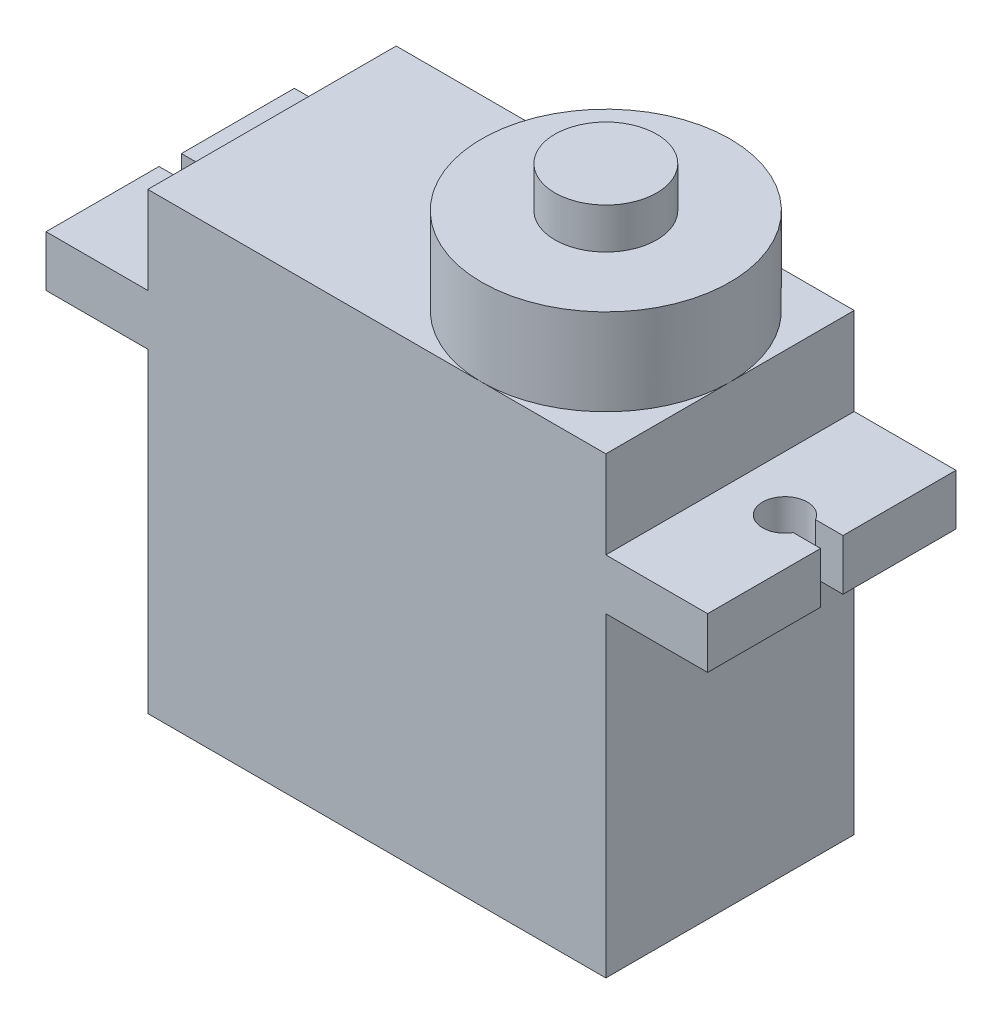
ISO-10303-21;
HEADER;
FILE_DESCRIPTION(('STEP AP214'),'2;1');
FILE_NAME('part.step','',(''),(''),'','','');
FILE_SCHEMA(('AUTOMOTIVE_DESIGN { 1 0 10303 214 1 1 1 1 }'));
ENDSEC;
DATA;
#1=APPLICATION_CONTEXT('core data for automotive mechanical design processes');
#2=APPLICATION_PROTOCOL_DEFINITION('international standard','automotive_design',2000,#1);
#3=PRODUCT_CONTEXT('',#1,'mechanical');
#4=PRODUCT('Part','Part','',(#3));
#5=PRODUCT_RELATED_PRODUCT_CATEGORY('part','',(#4));
#6=PRODUCT_DEFINITION_FORMATION('','',#4);
#7=PRODUCT_DEFINITION_CONTEXT('part definition',#1,'design');
#8=PRODUCT_DEFINITION('design','',#6,#7);
#9=PRODUCT_DEFINITION_SHAPE('','',#8);
#10=(LENGTH_UNIT() NAMED_UNIT(*) SI_UNIT(.MILLI.,.METRE.));
#11=(NAMED_UNIT(*) PLANE_ANGLE_UNIT() SI_UNIT($,.RADIAN.));
#12=(NAMED_UNIT(*) SI_UNIT($,.STERADIAN.) SOLID_ANGLE_UNIT());
#13=UNCERTAINTY_MEASURE_WITH_UNIT(LENGTH_MEASURE(1.E-05),#10,'distance_accuracy_value','');
#14=(GEOMETRIC_REPRESENTATION_CONTEXT(3) GLOBAL_UNCERTAINTY_ASSIGNED_CONTEXT((#13)) GLOBAL_UNIT_ASSIGNED_CONTEXT((#10,
#11,#12)) REPRESENTATION_CONTEXT('',''));
#15=CARTESIAN_POINT('',(0.,0.,0.));
#16=DIRECTION('',(0.,0.,1.));
#17=DIRECTION('',(1.,0.,0.));
#18=AXIS2_PLACEMENT_3D('',#15,#16,#17);
#19=CARTESIAN_POINT('',(0.,22.3,0.));
#20=DIRECTION('',(0.,1.,0.));
#21=DIRECTION('',(0.,0.,1.));
#22=AXIS2_PLACEMENT_3D('',#19,#20,#21);
#23=PLANE('',#22);
#24=CARTESIAN_POINT('',(8.51903614457832,22.3,0.994939759036145));
#25=DIRECTION('',(0.,1.,0.));
#26=DIRECTION('',(0.,0.,1.));
#27=AXIS2_PLACEMENT_3D('',#24,#25,#26);
#28=CIRCLE('',#27,6.1);
#29=CARTESIAN_POINT('',(8.51903614457832,22.3,7.09493975903614));
#30=VERTEX_POINT('',#29);
#31=CARTESIAN_POINT('',(14.6190361445783,22.3,0.994939759036145));
#32=VERTEX_POINT('',#31);
#33=EDGE_CURVE('E211',#30,#32,#28,.T.);
#34=ORIENTED_EDGE('',*,*,#33,.F.);
#35=DIRECTION('',(1.,0.,0.));
#36=VECTOR('',#35,1.);
#37=CARTESIAN_POINT('',(-7.88096385542167,22.3,7.09493975903614));
#38=LINE('',#37,#36);
#39=CARTESIAN_POINT('',(14.6190361445783,22.3,7.09493975903614));
#40=VERTEX_POINT('',#39);
#41=EDGE_CURVE('E198',#30,#40,#38,.T.);
#42=ORIENTED_EDGE('',*,*,#41,.T.);
#43=DIRECTION('',(0.,0.,-1.));
#44=VECTOR('',#43,1.);
#45=CARTESIAN_POINT('',(14.6190361445783,22.3,-5.10506024096386));
#46=LINE('',#45,#44);
#47=EDGE_CURVE('E212',#40,#32,#46,.T.);
#48=ORIENTED_EDGE('',*,*,#47,.T.);
#49=EDGE_LOOP('',(#34,#42,#48));
#50=FACE_BOUND('',#49,.T.);
#51=ADVANCED_FACE('F41',(#50),#23,.T.);
#52=CARTESIAN_POINT('',(8.51903614457832,22.3,-5.10506024096385));
#53=VERTEX_POINT('',#52);
#54=EDGE_CURVE('E51',#32,#53,#28,.T.);
#55=ORIENTED_EDGE('',*,*,#54,.F.);
#56=CARTESIAN_POINT('',(14.6190361445783,22.3,-5.10506024096386));
#57=VERTEX_POINT('',#56);
#58=EDGE_CURVE('E197',#32,#57,#46,.T.);
#59=ORIENTED_EDGE('',*,*,#58,.T.);
#60=DIRECTION('',(-1.,0.,0.));
#61=VECTOR('',#60,1.);
#62=CARTESIAN_POINT('',(-7.88096385542168,22.3,-5.10506024096386));
#63=LINE('',#62,#61);
#64=EDGE_CURVE('E363',#57,#53,#63,.T.);
#65=ORIENTED_EDGE('',*,*,#64,.T.);
#66=EDGE_LOOP('',(#55,#59,#65));
#67=FACE_BOUND('',#66,.T.);
#68=ADVANCED_FACE('F454',(#67),#23,.T.);
#69=CARTESIAN_POINT('',(-12.8809638554217,0.,0.));
#70=DIRECTION('',(-1.,0.,0.));
#71=DIRECTION('',(0.,0.,-1.));
#72=AXIS2_PLACEMENT_3D('',#69,#70,#71);
#73=PLANE('',#72);
#74=DIRECTION('',(0.,0.,1.));
#75=VECTOR('',#74,1.);
#76=CARTESIAN_POINT('',(-12.8809638554217,18.,7.09493975903614));
#77=LINE('',#76,#75);
#78=CARTESIAN_POINT('',(-12.8809638554217,18.,1.54493975903614));
#79=VERTEX_POINT('',#78);
#80=CARTESIAN_POINT('',(-12.8809638554217,18.,7.09493975903614));
#81=VERTEX_POINT('',#80);
#82=EDGE_CURVE('E255',#79,#81,#77,.T.);
#83=ORIENTED_EDGE('',*,*,#82,.F.);
#84=DIRECTION('',(0.,-1.,0.));
#85=VECTOR('',#84,1.);
#86=CARTESIAN_POINT('',(-12.8809638554217,0.,1.54493975903614));
#87=LINE('',#86,#85);
#88=CARTESIAN_POINT('',(-12.8809638554217,15.5,1.54493975903614));
#89=VERTEX_POINT('',#88);
#90=EDGE_CURVE('E403',#79,#89,#87,.T.);
#91=ORIENTED_EDGE('',*,*,#90,.T.);
#92=DIRECTION('',(0.,0.,-1.));
#93=VECTOR('',#92,1.);
#94=CARTESIAN_POINT('',(-12.8809638554217,15.5,7.09493975903614));
#95=LINE('',#94,#93);
#96=CARTESIAN_POINT('',(-12.8809638554217,15.5,7.09493975903614));
#97=VERTEX_POINT('',#96);
#98=EDGE_CURVE('E266',#97,#89,#95,.T.);
#99=ORIENTED_EDGE('',*,*,#98,.F.);
#100=DIRECTION('',(0.,-1.,0.));
#101=VECTOR('',#100,1.);
#102=CARTESIAN_POINT('',(-12.8809638554217,18.,7.09493975903614));
#103=LINE('',#102,#101);
#104=EDGE_CURVE('E251',#81,#97,#103,.T.);
#105=ORIENTED_EDGE('',*,*,#104,.F.);
#106=EDGE_LOOP('',(#83,#91,#99,#105));
#107=FACE_BOUND('',#106,.T.);
#108=ADVANCED_FACE('F459',(#107),#73,.T.);
#109=CARTESIAN_POINT('',(-7.88096385542168,22.3,-5.10506024096386));
#110=DIRECTION('',(1.,0.,0.));
#111=DIRECTION('',(0.,0.,-1.));
#112=AXIS2_PLACEMENT_3D('',#109,#110,#111);
#113=PLANE('',#112);
#114=DIRECTION('',(0.,-1.,0.));
#115=VECTOR('',#114,1.);
#116=CARTESIAN_POINT('',(-7.88096385542167,22.3,7.09493975903614));
#117=LINE('',#116,#115);
#118=CARTESIAN_POINT('',(-7.88096385542167,15.5,7.09493975903614));
#119=VERTEX_POINT('',#118);
#120=CARTESIAN_POINT('',(-7.88096385542167,0.,7.09493975903614));
#121=VERTEX_POINT('',#120);
#122=EDGE_CURVE('E392',#119,#121,#117,.T.);
#123=ORIENTED_EDGE('',*,*,#122,.F.);
#124=DIRECTION('',(0.,0.,-1.));
#125=VECTOR('',#124,1.);
#126=CARTESIAN_POINT('',(-7.88096385542167,15.5,7.09493975903614));
#127=LINE('',#126,#125);
#128=CARTESIAN_POINT('',(-7.88096385542167,15.5,-5.10506024096385));
#129=VERTEX_POINT('',#128);
#130=EDGE_CURVE('E256',#119,#129,#127,.T.);
#131=ORIENTED_EDGE('',*,*,#130,.T.);
#132=DIRECTION('',(0.,-1.,0.));
#133=VECTOR('',#132,1.);
#134=CARTESIAN_POINT('',(-7.88096385542168,22.3,-5.10506024096386));
#135=LINE('',#134,#133);
#136=CARTESIAN_POINT('',(-7.88096385542168,0.,-5.10506024096386));
#137=VERTEX_POINT('',#136);
#138=EDGE_CURVE('E366',#129,#137,#135,.T.);
#139=ORIENTED_EDGE('',*,*,#138,.T.);
#140=DIRECTION('',(0.,0.,1.));
#141=VECTOR('',#140,1.);
#142=CARTESIAN_POINT('',(-7.88096385542168,0.,-5.10506024096386));
#143=LINE('',#142,#141);
#144=EDGE_CURVE('E356',#137,#121,#143,.T.);
#145=ORIENTED_EDGE('',*,*,#144,.T.);
#146=EDGE_LOOP('',(#123,#131,#139,#145));
#147=FACE_BOUND('',#146,.T.);
#148=ADVANCED_FACE('F542',(#147),#113,.F.);
#149=CARTESIAN_POINT('',(19.6190361445783,15.5,7.09493975903614));
#150=DIRECTION('',(0.,1.,0.));
#151=DIRECTION('',(0.,0.,1.));
#152=AXIS2_PLACEMENT_3D('',#149,#150,#151);
#153=PLANE('',#152);
#154=DIRECTION('',(1.,0.,0.));
#155=VECTOR('',#154,1.);
#156=CARTESIAN_POINT('',(19.6190361445783,15.5,0.444939759036144));
#157=LINE('',#156,#155);
#158=CARTESIAN_POINT('',(18.2716640887412,15.5,0.444939759036143));
#159=VERTEX_POINT('',#158);
#160=CARTESIAN_POINT('',(19.6190361445783,15.5,0.444939759036144));
#161=VERTEX_POINT('',#160);
#162=EDGE_CURVE('E309',#159,#161,#157,.T.);
#163=ORIENTED_EDGE('',*,*,#162,.F.);
#164=CARTESIAN_POINT('',(17.3190361445783,15.5,0.994939759036145));
#165=DIRECTION('',(0.,1.,0.));
#166=DIRECTION('',(0.,0.,1.));
#167=AXIS2_PLACEMENT_3D('',#164,#165,#166);
#168=CIRCLE('',#167,1.1);
#169=CARTESIAN_POINT('',(18.2716640887412,15.5,1.54493975903614));
#170=VERTEX_POINT('',#169);
#171=EDGE_CURVE('E312',#159,#170,#168,.T.);
#172=ORIENTED_EDGE('',*,*,#171,.T.);
#173=DIRECTION('',(1.,0.,0.));
#174=VECTOR('',#173,1.);
#175=CARTESIAN_POINT('',(19.6190361445783,15.5,1.54493975903614));
#176=LINE('',#175,#174);
#177=CARTESIAN_POINT('',(19.6190361445783,15.5,1.54493975903614));
#178=VERTEX_POINT('',#177);
#179=EDGE_CURVE('E305',#170,#178,#176,.T.);
#180=ORIENTED_EDGE('',*,*,#179,.T.);
#181=DIRECTION('',(0.,0.,-1.));
#182=VECTOR('',#181,1.);
#183=CARTESIAN_POINT('',(19.6190361445783,15.5,7.09493975903614));
#184=LINE('',#183,#182);
#185=CARTESIAN_POINT('',(19.6190361445783,15.5,7.09493975903614));
#186=VERTEX_POINT('',#185);
#187=EDGE_CURVE('E323',#186,#178,#184,.T.);
#188=ORIENTED_EDGE('',*,*,#187,.F.);
#189=DIRECTION('',(-1.,0.,0.));
#190=VECTOR('',#189,1.);
#191=CARTESIAN_POINT('',(19.6190361445783,15.5,7.09493975903614));
#192=LINE('',#191,#190);
#193=CARTESIAN_POINT('',(14.6190361445783,15.5,7.09493975903614));
#194=VERTEX_POINT('',#193);
#195=EDGE_CURVE('E352',#186,#194,#192,.T.);
#196=ORIENTED_EDGE('',*,*,#195,.T.);
#197=DIRECTION('',(0.,0.,-1.));
#198=VECTOR('',#197,1.);
#199=CARTESIAN_POINT('',(14.6190361445783,15.5,7.09493975903614));
#200=LINE('',#199,#198);
#201=CARTESIAN_POINT('',(14.6190361445783,15.5,-5.10506024096385));
#202=VERTEX_POINT('',#201);
#203=EDGE_CURVE('E316',#194,#202,#200,.T.);
#204=ORIENTED_EDGE('',*,*,#203,.T.);
#205=DIRECTION('',(-1.,0.,0.));
#206=VECTOR('',#205,1.);
#207=CARTESIAN_POINT('',(19.6190361445783,15.5,-5.10506024096385));
#208=LINE('',#207,#206);
#209=CARTESIAN_POINT('',(19.6190361445783,15.5,-5.10506024096385));
#210=VERTEX_POINT('',#209);
#211=EDGE_CURVE('E348',#210,#202,#208,.T.);
#212=ORIENTED_EDGE('',*,*,#211,.F.);
#213=EDGE_CURVE('E321',#161,#210,#184,.T.);
#214=ORIENTED_EDGE('',*,*,#213,.F.);
#215=EDGE_LOOP('',(#163,#172,#180,#188,#196,#204,#212,#214));
#216=FACE_BOUND('',#215,.T.);
#217=ADVANCED_FACE('F503',(#216),#153,.F.);
#218=CARTESIAN_POINT('',(19.6190361445783,18.,7.09493975903614));
#219=DIRECTION('',(0.,-1.,0.));
#220=DIRECTION('',(0.,0.,-1.));
#221=AXIS2_PLACEMENT_3D('',#218,#219,#220);
#222=PLANE('',#221);
#223=DIRECTION('',(1.,0.,0.));
#224=VECTOR('',#223,1.);
#225=CARTESIAN_POINT('',(18.2716640887412,18.,0.444939759036144));
#226=LINE('',#225,#224);
#227=CARTESIAN_POINT('',(18.2716640887412,18.,0.444939759036143));
#228=VERTEX_POINT('',#227);
#229=CARTESIAN_POINT('',(19.6190361445783,18.,0.444939759036144));
#230=VERTEX_POINT('',#229);
#231=EDGE_CURVE('E288',#228,#230,#226,.T.);
#232=ORIENTED_EDGE('',*,*,#231,.T.);
#233=DIRECTION('',(0.,0.,1.));
#234=VECTOR('',#233,1.);
#235=CARTESIAN_POINT('',(19.6190361445783,18.,7.09493975903614));
#236=LINE('',#235,#234);
#237=CARTESIAN_POINT('',(19.6190361445783,18.,-5.10506024096386));
#238=VERTEX_POINT('',#237);
#239=EDGE_CURVE('E331',#238,#230,#236,.T.);
#240=ORIENTED_EDGE('',*,*,#239,.F.);
#241=DIRECTION('',(-1.,0.,0.));
#242=VECTOR('',#241,1.);
#243=CARTESIAN_POINT('',(19.6190361445783,18.,-5.10506024096386));
#244=LINE('',#243,#242);
#245=CARTESIAN_POINT('',(14.6190361445783,18.,-5.10506024096386));
#246=VERTEX_POINT('',#245);
#247=EDGE_CURVE('E344',#238,#246,#244,.T.);
#248=ORIENTED_EDGE('',*,*,#247,.T.);
#249=DIRECTION('',(0.,0.,1.));
#250=VECTOR('',#249,1.);
#251=CARTESIAN_POINT('',(14.6190361445783,18.,7.09493975903614));
#252=LINE('',#251,#250);
#253=CARTESIAN_POINT('',(14.6190361445783,18.,7.09493975903614));
#254=VERTEX_POINT('',#253);
#255=EDGE_CURVE('E322',#246,#254,#252,.T.);
#256=ORIENTED_EDGE('',*,*,#255,.T.);
#257=DIRECTION('',(-1.,0.,0.));
#258=VECTOR('',#257,1.);
#259=CARTESIAN_POINT('',(19.6190361445783,18.,7.09493975903614));
#260=LINE('',#259,#258);
#261=CARTESIAN_POINT('',(19.6190361445783,18.,7.09493975903614));
#262=VERTEX_POINT('',#261);
#263=EDGE_CURVE('E335',#262,#254,#260,.T.);
#264=ORIENTED_EDGE('',*,*,#263,.F.);
#265=CARTESIAN_POINT('',(19.6190361445783,18.,1.54493975903614));
#266=VERTEX_POINT('',#265);
#267=EDGE_CURVE('E330',#266,#262,#236,.T.);
#268=ORIENTED_EDGE('',*,*,#267,.F.);
#269=DIRECTION('',(1.,0.,0.));
#270=VECTOR('',#269,1.);
#271=CARTESIAN_POINT('',(18.2716640887412,18.,1.54493975903614));
#272=LINE('',#271,#270);
#273=CARTESIAN_POINT('',(18.2716640887412,18.,1.54493975903614));
#274=VERTEX_POINT('',#273);
#275=EDGE_CURVE('E292',#274,#266,#272,.T.);
#276=ORIENTED_EDGE('',*,*,#275,.F.);
#277=CARTESIAN_POINT('',(17.3190361445783,18.,0.994939759036145));
#278=DIRECTION('',(0.,1.,0.));
#279=DIRECTION('',(0.,0.,1.));
#280=AXIS2_PLACEMENT_3D('',#277,#278,#279);
#281=CIRCLE('',#280,1.1);
#282=EDGE_CURVE('E295',#228,#274,#281,.T.);
#283=ORIENTED_EDGE('',*,*,#282,.F.);
#284=EDGE_LOOP('',(#232,#240,#248,#256,#264,#268,#276,#283));
#285=FACE_BOUND('',#284,.T.);
#286=ADVANCED_FACE('F487',(#285),#222,.F.);
#287=CARTESIAN_POINT('',(19.6190361445783,0.,0.));
#288=DIRECTION('',(1.,0.,0.));
#289=DIRECTION('',(0.,0.,-1.));
#290=AXIS2_PLACEMENT_3D('',#287,#288,#289);
#291=PLANE('',#290);
#292=ORIENTED_EDGE('',*,*,#239,.T.);
#293=DIRECTION('',(0.,-1.,0.));
#294=VECTOR('',#293,1.);
#295=CARTESIAN_POINT('',(19.6190361445783,0.,0.444939759036144));
#296=LINE('',#295,#294);
#297=EDGE_CURVE('E399',#230,#161,#296,.T.);
#298=ORIENTED_EDGE('',*,*,#297,.T.);
#299=ORIENTED_EDGE('',*,*,#213,.T.);
#300=DIRECTION('',(0.,1.,0.));
#301=VECTOR('',#300,1.);
#302=CARTESIAN_POINT('',(19.6190361445783,18.,-5.10506024096386));
#303=LINE('',#302,#301);
#304=EDGE_CURVE('E327',#210,#238,#303,.T.);
#305=ORIENTED_EDGE('',*,*,#304,.T.);
#306=EDGE_LOOP('',(#292,#298,#299,#305));
#307=FACE_BOUND('',#306,.T.);
#308=ADVANCED_FACE('F480',(#307),#291,.T.);
#309=CARTESIAN_POINT('',(14.6190361445783,22.3,-5.10506024096386));
#310=DIRECTION('',(-1.,0.,0.));
#311=DIRECTION('',(0.,0.,1.));
#312=AXIS2_PLACEMENT_3D('',#309,#310,#311);
#313=PLANE('',#312);
#314=ORIENTED_EDGE('',*,*,#255,.F.);
#315=DIRECTION('',(0.,-1.,0.));
#316=VECTOR('',#315,1.);
#317=CARTESIAN_POINT('',(14.6190361445783,22.3,-5.10506024096386));
#318=LINE('',#317,#316);
#319=EDGE_CURVE('E385',#57,#246,#318,.T.);
#320=ORIENTED_EDGE('',*,*,#319,.F.);
#321=ORIENTED_EDGE('',*,*,#58,.F.);
#322=ORIENTED_EDGE('',*,*,#47,.F.);
#323=DIRECTION('',(0.,-1.,0.));
#324=VECTOR('',#323,1.);
#325=CARTESIAN_POINT('',(14.6190361445783,22.3,7.09493975903614));
#326=LINE('',#325,#324);
#327=EDGE_CURVE('E205',#40,#254,#326,.T.);
#328=ORIENTED_EDGE('',*,*,#327,.T.);
#329=EDGE_LOOP('',(#314,#320,#321,#322,#328));
#330=FACE_BOUND('',#329,.T.);
#331=ADVANCED_FACE('F477',(#330),#313,.F.);
#332=ORIENTED_EDGE('',*,*,#203,.F.);
#333=CARTESIAN_POINT('',(14.6190361445783,0.,7.09493975903614));
#334=VERTEX_POINT('',#333);
#335=EDGE_CURVE('E389',#194,#334,#326,.T.);
#336=ORIENTED_EDGE('',*,*,#335,.T.);
#337=DIRECTION('',(0.,0.,-1.));
#338=VECTOR('',#337,1.);
#339=CARTESIAN_POINT('',(14.6190361445783,0.,-5.10506024096386));
#340=LINE('',#339,#338);
#341=CARTESIAN_POINT('',(14.6190361445783,0.,-5.10506024096386));
#342=VERTEX_POINT('',#341);
#343=EDGE_CURVE('E373',#334,#342,#340,.T.);
#344=ORIENTED_EDGE('',*,*,#343,.T.);
#345=EDGE_CURVE('E384',#202,#342,#318,.T.);
#346=ORIENTED_EDGE('',*,*,#345,.F.);
#347=EDGE_LOOP('',(#332,#336,#344,#346));
#348=FACE_BOUND('',#347,.T.);
#349=ADVANCED_FACE('F479',(#348),#313,.F.);
#350=CARTESIAN_POINT('',(-7.88096385542168,22.3,-5.10506024096386));
#351=VERTEX_POINT('',#350);
#352=CARTESIAN_POINT('',(-7.88096385542167,18.,-5.10506024096386));
#353=VERTEX_POINT('',#352);
#354=EDGE_CURVE('E380',#351,#353,#135,.T.);
#355=ORIENTED_EDGE('',*,*,#354,.T.);
#356=DIRECTION('',(0.,0.,1.));
#357=VECTOR('',#356,1.);
#358=CARTESIAN_POINT('',(-7.88096385542167,18.,7.09493975903614));
#359=LINE('',#358,#357);
#360=CARTESIAN_POINT('',(-7.88096385542167,18.,7.09493975903614));
#361=VERTEX_POINT('',#360);
#362=EDGE_CURVE('E250',#353,#361,#359,.T.);
#363=ORIENTED_EDGE('',*,*,#362,.T.);
#364=CARTESIAN_POINT('',(-7.88096385542167,22.3,7.09493975903614));
#365=VERTEX_POINT('',#364);
#366=EDGE_CURVE('E393',#365,#361,#117,.T.);
#367=ORIENTED_EDGE('',*,*,#366,.F.);
#368=DIRECTION('',(0.,0.,1.));
#369=VECTOR('',#368,1.);
#370=CARTESIAN_POINT('',(-7.88096385542168,22.3,-5.10506024096386));
#371=LINE('',#370,#369);
#372=EDGE_CURVE('E192',#351,#365,#371,.T.);
#373=ORIENTED_EDGE('',*,*,#372,.F.);
#374=EDGE_LOOP('',(#355,#363,#367,#373));
#375=FACE_BOUND('',#374,.T.);
#376=ADVANCED_FACE('F43',(#375),#113,.F.);
#377=CARTESIAN_POINT('',(-7.88096385542167,22.3,7.09493975903614));
#378=DIRECTION('',(0.,0.,-1.));
#379=DIRECTION('',(-1.,0.,0.));
#380=AXIS2_PLACEMENT_3D('',#377,#378,#379);
#381=PLANE('',#380);
#382=DIRECTION('',(1.,0.,0.));
#383=VECTOR('',#382,1.);
#384=CARTESIAN_POINT('',(-7.88096385542167,0.,7.09493975903614));
#385=LINE('',#384,#383);
#386=EDGE_CURVE('E370',#121,#334,#385,.T.);
#387=ORIENTED_EDGE('',*,*,#386,.T.);
#388=ORIENTED_EDGE('',*,*,#335,.F.);
#389=ORIENTED_EDGE('',*,*,#195,.F.);
#390=DIRECTION('',(0.,-1.,0.));
#391=VECTOR('',#390,1.);
#392=CARTESIAN_POINT('',(19.6190361445783,18.,7.09493975903614));
#393=LINE('',#392,#391);
#394=EDGE_CURVE('E317',#262,#186,#393,.T.);
#395=ORIENTED_EDGE('',*,*,#394,.F.);
#396=ORIENTED_EDGE('',*,*,#263,.T.);
#397=ORIENTED_EDGE('',*,*,#327,.F.);
#398=ORIENTED_EDGE('',*,*,#41,.F.);
#399=EDGE_CURVE('E188',#365,#30,#38,.T.);
#400=ORIENTED_EDGE('',*,*,#399,.F.);
#401=ORIENTED_EDGE('',*,*,#366,.T.);
#402=DIRECTION('',(1.,0.,0.));
#403=VECTOR('',#402,1.);
#404=CARTESIAN_POINT('',(-12.8809638554217,18.,7.09493975903614));
#405=LINE('',#404,#403);
#406=EDGE_CURVE('E285',#81,#361,#405,.T.);
#407=ORIENTED_EDGE('',*,*,#406,.F.);
#408=ORIENTED_EDGE('',*,*,#104,.T.);
#409=DIRECTION('',(1.,0.,0.));
#410=VECTOR('',#409,1.);
#411=CARTESIAN_POINT('',(-12.8809638554217,15.5,7.09493975903614));
#412=LINE('',#411,#410);
#413=EDGE_CURVE('E270',#97,#119,#412,.T.);
#414=ORIENTED_EDGE('',*,*,#413,.T.);
#415=ORIENTED_EDGE('',*,*,#122,.T.);
#416=EDGE_LOOP('',(#387,#388,#389,#395,#396,#397,#398,#400,#401,#407,#408,#414,#415));
#417=FACE_BOUND('',#416,.T.);
#418=ADVANCED_FACE('F203',(#417),#381,.F.);
#419=CARTESIAN_POINT('',(-7.88096385542168,22.3,-5.10506024096386));
#420=DIRECTION('',(0.,0.,1.));
#421=DIRECTION('',(1.,0.,0.));
#422=AXIS2_PLACEMENT_3D('',#419,#420,#421);
#423=PLANE('',#422);
#424=DIRECTION('',(-1.,0.,0.));
#425=VECTOR('',#424,1.);
#426=CARTESIAN_POINT('',(-7.88096385542168,0.,-5.10506024096386));
#427=LINE('',#426,#425);
#428=EDGE_CURVE('E358',#342,#137,#427,.T.);
#429=ORIENTED_EDGE('',*,*,#428,.T.);
#430=ORIENTED_EDGE('',*,*,#138,.F.);
#431=DIRECTION('',(1.,0.,0.));
#432=VECTOR('',#431,1.);
#433=CARTESIAN_POINT('',(-12.8809638554217,15.5,-5.10506024096385));
#434=LINE('',#433,#432);
#435=CARTESIAN_POINT('',(-12.8809638554217,15.5,-5.10506024096385));
#436=VERTEX_POINT('',#435);
#437=EDGE_CURVE('E279',#436,#129,#434,.T.);
#438=ORIENTED_EDGE('',*,*,#437,.F.);
#439=DIRECTION('',(0.,1.,0.));
#440=VECTOR('',#439,1.);
#441=CARTESIAN_POINT('',(-12.8809638554217,18.,-5.10506024096386));
#442=LINE('',#441,#440);
#443=CARTESIAN_POINT('',(-12.8809638554217,18.,-5.10506024096386));
#444=VERTEX_POINT('',#443);
#445=EDGE_CURVE('E261',#436,#444,#442,.T.);
#446=ORIENTED_EDGE('',*,*,#445,.T.);
#447=DIRECTION('',(1.,0.,0.));
#448=VECTOR('',#447,1.);
#449=CARTESIAN_POINT('',(-12.8809638554217,18.,-5.10506024096386));
#450=LINE('',#449,#448);
#451=EDGE_CURVE('E282',#444,#353,#450,.T.);
#452=ORIENTED_EDGE('',*,*,#451,.T.);
#453=ORIENTED_EDGE('',*,*,#354,.F.);
#454=EDGE_CURVE('E362',#53,#351,#63,.T.);
#455=ORIENTED_EDGE('',*,*,#454,.F.);
#456=ORIENTED_EDGE('',*,*,#64,.F.);
#457=ORIENTED_EDGE('',*,*,#319,.T.);
#458=ORIENTED_EDGE('',*,*,#247,.F.);
#459=ORIENTED_EDGE('',*,*,#304,.F.);
#460=ORIENTED_EDGE('',*,*,#211,.T.);
#461=ORIENTED_EDGE('',*,*,#345,.T.);
#462=EDGE_LOOP('',(#429,#430,#438,#446,#452,#453,#455,#456,#457,#458,#459,#460,#461));
#463=FACE_BOUND('',#462,.T.);
#464=ADVANCED_FACE('F464',(#463),#423,.F.);
#465=EDGE_CURVE('E59',#53,#30,#28,.T.);
#466=ORIENTED_EDGE('',*,*,#465,.F.);
#467=ORIENTED_EDGE('',*,*,#454,.T.);
#468=ORIENTED_EDGE('',*,*,#372,.T.);
#469=ORIENTED_EDGE('',*,*,#399,.T.);
#470=EDGE_LOOP('',(#466,#467,#468,#469));
#471=FACE_BOUND('',#470,.T.);
#472=ADVANCED_FACE('F190',(#471),#23,.T.);
#473=CARTESIAN_POINT('',(0.,0.,0.));
#474=DIRECTION('',(0.,1.,0.));
#475=DIRECTION('',(0.,0.,1.));
#476=AXIS2_PLACEMENT_3D('',#473,#474,#475);
#477=PLANE('',#476);
#478=ORIENTED_EDGE('',*,*,#144,.F.);
#479=ORIENTED_EDGE('',*,*,#428,.F.);
#480=ORIENTED_EDGE('',*,*,#343,.F.);
#481=ORIENTED_EDGE('',*,*,#386,.F.);
#482=EDGE_LOOP('',(#478,#479,#480,#481));
#483=FACE_BOUND('',#482,.T.);
#484=ADVANCED_FACE('F463',(#483),#477,.F.);
#485=DIRECTION('',(0.,-1.,0.));
#486=VECTOR('',#485,1.);
#487=CARTESIAN_POINT('',(19.6190361445783,0.,1.54493975903614));
#488=LINE('',#487,#486);
#489=EDGE_CURVE('E396',#266,#178,#488,.T.);
#490=ORIENTED_EDGE('',*,*,#489,.F.);
#491=ORIENTED_EDGE('',*,*,#267,.T.);
#492=ORIENTED_EDGE('',*,*,#394,.T.);
#493=ORIENTED_EDGE('',*,*,#187,.T.);
#494=EDGE_LOOP('',(#490,#491,#492,#493));
#495=FACE_BOUND('',#494,.T.);
#496=ADVANCED_FACE('F469',(#495),#291,.T.);
#497=CARTESIAN_POINT('',(17.3190361445783,0.,0.994939759036145));
#498=DIRECTION('',(0.,1.,0.));
#499=DIRECTION('',(0.,0.,1.));
#500=AXIS2_PLACEMENT_3D('',#497,#498,#499);
#501=CYLINDRICAL_SURFACE('',#500,1.1);
#502=DIRECTION('',(0.,1.,0.));
#503=VECTOR('',#502,1.);
#504=CARTESIAN_POINT('',(18.2716640887412,0.,0.444939759036143));
#505=LINE('',#504,#503);
#506=EDGE_CURVE('E299',#159,#228,#505,.T.);
#507=ORIENTED_EDGE('',*,*,#506,.T.);
#508=ORIENTED_EDGE('',*,*,#282,.T.);
#509=DIRECTION('',(0.,1.,0.));
#510=VECTOR('',#509,1.);
#511=CARTESIAN_POINT('',(18.2716640887412,0.,1.54493975903614));
#512=LINE('',#511,#510);
#513=EDGE_CURVE('E302',#170,#274,#512,.T.);
#514=ORIENTED_EDGE('',*,*,#513,.F.);
#515=ORIENTED_EDGE('',*,*,#171,.F.);
#516=EDGE_LOOP('',(#507,#508,#514,#515));
#517=FACE_BOUND('',#516,.T.);
#518=ADVANCED_FACE('F525',(#517),#501,.F.);
#519=CARTESIAN_POINT('',(18.2716640887412,0.,0.444939759036144));
#520=DIRECTION('',(0.,0.,1.));
#521=DIRECTION('',(1.,0.,0.));
#522=AXIS2_PLACEMENT_3D('',#519,#520,#521);
#523=PLANE('',#522);
#524=ORIENTED_EDGE('',*,*,#162,.T.);
#525=ORIENTED_EDGE('',*,*,#297,.F.);
#526=ORIENTED_EDGE('',*,*,#231,.F.);
#527=ORIENTED_EDGE('',*,*,#506,.F.);
#528=EDGE_LOOP('',(#524,#525,#526,#527));
#529=FACE_BOUND('',#528,.T.);
#530=ADVANCED_FACE('F528',(#529),#523,.T.);
#531=CARTESIAN_POINT('',(18.2716640887412,0.,1.54493975903614));
#532=DIRECTION('',(0.,0.,1.));
#533=DIRECTION('',(1.,0.,0.));
#534=AXIS2_PLACEMENT_3D('',#531,#532,#533);
#535=PLANE('',#534);
#536=ORIENTED_EDGE('',*,*,#513,.T.);
#537=ORIENTED_EDGE('',*,*,#275,.T.);
#538=ORIENTED_EDGE('',*,*,#489,.T.);
#539=ORIENTED_EDGE('',*,*,#179,.F.);
#540=EDGE_LOOP('',(#536,#537,#538,#539));
#541=FACE_BOUND('',#540,.T.);
#542=ADVANCED_FACE('F522',(#541),#535,.F.);
#543=CARTESIAN_POINT('',(-12.8809638554217,18.,7.09493975903614));
#544=DIRECTION('',(0.,1.,0.));
#545=DIRECTION('',(0.,0.,1.));
#546=AXIS2_PLACEMENT_3D('',#543,#544,#545);
#547=PLANE('',#546);
#548=DIRECTION('',(-1.,0.,0.));
#549=VECTOR('',#548,1.);
#550=CARTESIAN_POINT('',(-11.5335917995846,18.,0.444939759036144));
#551=LINE('',#550,#549);
#552=CARTESIAN_POINT('',(-11.5335917995846,18.,0.444939759036143));
#553=VERTEX_POINT('',#552);
#554=CARTESIAN_POINT('',(-12.8809638554217,18.,0.444939759036144));
#555=VERTEX_POINT('',#554);
#556=EDGE_CURVE('E226',#553,#555,#551,.T.);
#557=ORIENTED_EDGE('',*,*,#556,.F.);
#558=CARTESIAN_POINT('',(-10.5809638554217,18.,0.994939759036145));
#559=DIRECTION('',(0.,-1.,0.));
#560=DIRECTION('',(0.,0.,1.));
#561=AXIS2_PLACEMENT_3D('',#558,#559,#560);
#562=CIRCLE('',#561,1.1);
#563=CARTESIAN_POINT('',(-11.5335917995846,18.,1.54493975903614));
#564=VERTEX_POINT('',#563);
#565=EDGE_CURVE('E229',#553,#564,#562,.T.);
#566=ORIENTED_EDGE('',*,*,#565,.T.);
#567=DIRECTION('',(-1.,0.,0.));
#568=VECTOR('',#567,1.);
#569=CARTESIAN_POINT('',(-11.5335917995846,18.,1.54493975903614));
#570=LINE('',#569,#568);
#571=EDGE_CURVE('E233',#564,#79,#570,.T.);
#572=ORIENTED_EDGE('',*,*,#571,.T.);
#573=ORIENTED_EDGE('',*,*,#82,.T.);
#574=ORIENTED_EDGE('',*,*,#406,.T.);
#575=ORIENTED_EDGE('',*,*,#362,.F.);
#576=ORIENTED_EDGE('',*,*,#451,.F.);
#577=EDGE_CURVE('E257',#444,#555,#77,.T.);
#578=ORIENTED_EDGE('',*,*,#577,.T.);
#579=EDGE_LOOP('',(#557,#566,#572,#573,#574,#575,#576,#578));
#580=FACE_BOUND('',#579,.T.);
#581=ADVANCED_FACE('F535',(#580),#547,.T.);
#582=CARTESIAN_POINT('',(-12.8809638554217,15.5,7.09493975903614));
#583=DIRECTION('',(0.,-1.,0.));
#584=DIRECTION('',(0.,0.,-1.));
#585=AXIS2_PLACEMENT_3D('',#582,#583,#584);
#586=PLANE('',#585);
#587=DIRECTION('',(1.,0.,0.));
#588=VECTOR('',#587,1.);
#589=CARTESIAN_POINT('',(-12.8809638554217,15.5,0.444939759036144));
#590=LINE('',#589,#588);
#591=CARTESIAN_POINT('',(-12.8809638554217,15.5,0.444939759036144));
#592=VERTEX_POINT('',#591);
#593=CARTESIAN_POINT('',(-11.5335917995846,15.5,0.444939759036143));
#594=VERTEX_POINT('',#593);
#595=EDGE_CURVE('E247',#592,#594,#590,.T.);
#596=ORIENTED_EDGE('',*,*,#595,.F.);
#597=EDGE_CURVE('E265',#592,#436,#95,.T.);
#598=ORIENTED_EDGE('',*,*,#597,.T.);
#599=ORIENTED_EDGE('',*,*,#437,.T.);
#600=ORIENTED_EDGE('',*,*,#130,.F.);
#601=ORIENTED_EDGE('',*,*,#413,.F.);
#602=ORIENTED_EDGE('',*,*,#98,.T.);
#603=DIRECTION('',(1.,0.,0.));
#604=VECTOR('',#603,1.);
#605=CARTESIAN_POINT('',(-12.8809638554217,15.5,1.54493975903614));
#606=LINE('',#605,#604);
#607=CARTESIAN_POINT('',(-11.5335917995846,15.5,1.54493975903614));
#608=VERTEX_POINT('',#607);
#609=EDGE_CURVE('E243',#89,#608,#606,.T.);
#610=ORIENTED_EDGE('',*,*,#609,.T.);
#611=CARTESIAN_POINT('',(-10.5809638554217,15.5,0.994939759036145));
#612=DIRECTION('',(0.,-1.,0.));
#613=DIRECTION('',(0.,0.,-1.));
#614=AXIS2_PLACEMENT_3D('',#611,#612,#613);
#615=CIRCLE('',#614,1.1);
#616=EDGE_CURVE('E45',#608,#594,#615,.F.);
#617=ORIENTED_EDGE('',*,*,#616,.T.);
#618=EDGE_LOOP('',(#596,#598,#599,#600,#601,#602,#610,#617));
#619=FACE_BOUND('',#618,.T.);
#620=ADVANCED_FACE('F417',(#619),#586,.T.);
#621=DIRECTION('',(0.,-1.,0.));
#622=VECTOR('',#621,1.);
#623=CARTESIAN_POINT('',(-12.8809638554217,0.,0.444939759036144));
#624=LINE('',#623,#622);
#625=EDGE_CURVE('E223',#555,#592,#624,.T.);
#626=ORIENTED_EDGE('',*,*,#625,.F.);
#627=ORIENTED_EDGE('',*,*,#577,.F.);
#628=ORIENTED_EDGE('',*,*,#445,.F.);
#629=ORIENTED_EDGE('',*,*,#597,.F.);
#630=EDGE_LOOP('',(#626,#627,#628,#629));
#631=FACE_BOUND('',#630,.T.);
#632=ADVANCED_FACE('F420',(#631),#73,.T.);
#633=CARTESIAN_POINT('',(-11.5335917995846,0.,0.444939759036144));
#634=DIRECTION('',(0.,0.,-1.));
#635=DIRECTION('',(-1.,0.,0.));
#636=AXIS2_PLACEMENT_3D('',#633,#634,#635);
#637=PLANE('',#636);
#638=ORIENTED_EDGE('',*,*,#595,.T.);
#639=DIRECTION('',(0.,1.,0.));
#640=VECTOR('',#639,1.);
#641=CARTESIAN_POINT('',(-11.5335917995846,0.,0.444939759036143));
#642=LINE('',#641,#640);
#643=EDGE_CURVE('E240',#594,#553,#642,.T.);
#644=ORIENTED_EDGE('',*,*,#643,.T.);
#645=ORIENTED_EDGE('',*,*,#556,.T.);
#646=ORIENTED_EDGE('',*,*,#625,.T.);
#647=EDGE_LOOP('',(#638,#644,#645,#646));
#648=FACE_BOUND('',#647,.T.);
#649=ADVANCED_FACE('F410',(#648),#637,.F.);
#650=CARTESIAN_POINT('',(-10.5809638554217,0.,0.994939759036145));
#651=DIRECTION('',(0.,1.,0.));
#652=DIRECTION('',(0.,0.,1.));
#653=AXIS2_PLACEMENT_3D('',#650,#651,#652);
#654=CYLINDRICAL_SURFACE('',#653,1.1);
#655=DIRECTION('',(0.,1.,0.));
#656=VECTOR('',#655,1.);
#657=CARTESIAN_POINT('',(-11.5335917995846,0.,1.54493975903614));
#658=LINE('',#657,#656);
#659=EDGE_CURVE('E237',#608,#564,#658,.T.);
#660=ORIENTED_EDGE('',*,*,#659,.T.);
#661=ORIENTED_EDGE('',*,*,#565,.F.);
#662=ORIENTED_EDGE('',*,*,#643,.F.);
#663=ORIENTED_EDGE('',*,*,#616,.F.);
#664=EDGE_LOOP('',(#660,#661,#662,#663));
#665=FACE_BOUND('',#664,.T.);
#666=ADVANCED_FACE('F450',(#665),#654,.F.);
#667=CARTESIAN_POINT('',(-11.5335917995846,0.,1.54493975903614));
#668=DIRECTION('',(0.,0.,-1.));
#669=DIRECTION('',(-1.,0.,0.));
#670=AXIS2_PLACEMENT_3D('',#667,#668,#669);
#671=PLANE('',#670);
#672=ORIENTED_EDGE('',*,*,#90,.F.);
#673=ORIENTED_EDGE('',*,*,#571,.F.);
#674=ORIENTED_EDGE('',*,*,#659,.F.);
#675=ORIENTED_EDGE('',*,*,#609,.F.);
#676=EDGE_LOOP('',(#672,#673,#674,#675));
#677=FACE_BOUND('',#676,.T.);
#678=ADVANCED_FACE('F445',(#677),#671,.T.);
#679=CARTESIAN_POINT('',(8.51903614457832,26.55,0.994939759036145));
#680=DIRECTION('',(0.,-1.,0.));
#681=DIRECTION('',(0.,0.,-1.));
#682=AXIS2_PLACEMENT_3D('',#679,#680,#681);
#683=CYLINDRICAL_SURFACE('',#682,6.1);
#684=CARTESIAN_POINT('',(8.51903614457832,26.55,0.994939759036145));
#685=DIRECTION('',(0.,1.,0.));
#686=DIRECTION('',(0.,0.,1.));
#687=AXIS2_PLACEMENT_3D('',#684,#685,#686);
#688=CIRCLE('',#687,6.1);
#689=CARTESIAN_POINT('',(8.51903614457832,26.55,7.09493975903614));
#690=VERTEX_POINT('',#689);
#691=EDGE_CURVE('E215',#690,#690,#688,.T.);
#692=ORIENTED_EDGE('',*,*,#691,.F.);
#693=EDGE_LOOP('',(#692));
#694=FACE_BOUND('',#693,.T.);
#695=ORIENTED_EDGE('',*,*,#33,.T.);
#696=ORIENTED_EDGE('',*,*,#54,.T.);
#697=ORIENTED_EDGE('',*,*,#465,.T.);
#698=EDGE_LOOP('',(#695,#696,#697));
#699=FACE_BOUND('',#698,.T.);
#700=ADVANCED_FACE('F218',(#694,#699),#683,.T.);
#701=CARTESIAN_POINT('',(8.51903614457832,26.55,0.994939759036145));
#702=DIRECTION('',(0.,1.,0.));
#703=DIRECTION('',(0.,0.,1.));
#704=AXIS2_PLACEMENT_3D('',#701,#702,#703);
#705=PLANE('',#704);
#706=CARTESIAN_POINT('',(8.51903614457832,26.55,0.994939759036145));
#707=DIRECTION('',(0.,1.,0.));
#708=DIRECTION('',(0.,0.,1.));
#709=AXIS2_PLACEMENT_3D('',#706,#707,#708);
#710=CIRCLE('',#709,2.5);
#711=CARTESIAN_POINT('',(8.51903614457832,26.55,3.49493975903615));
#712=VERTEX_POINT('',#711);
#713=EDGE_CURVE('E11',#712,#712,#710,.T.);
#714=ORIENTED_EDGE('',*,*,#713,.F.);
#715=EDGE_LOOP('',(#714));
#716=FACE_BOUND('',#715,.T.);
#717=ORIENTED_EDGE('',*,*,#691,.T.);
#718=EDGE_LOOP('',(#717));
#719=FACE_BOUND('',#718,.T.);
#720=ADVANCED_FACE('F435',(#716,#719),#705,.T.);
#721=CARTESIAN_POINT('',(8.51903614457832,28.55,0.994939759036145));
#722=DIRECTION('',(0.,-1.,0.));
#723=DIRECTION('',(0.,0.,-1.));
#724=AXIS2_PLACEMENT_3D('',#721,#722,#723);
#725=CYLINDRICAL_SURFACE('',#724,2.5);
#726=CARTESIAN_POINT('',(8.51903614457832,28.55,0.994939759036145));
#727=DIRECTION('',(0.,1.,0.));
#728=DIRECTION('',(0.,0.,1.));
#729=AXIS2_PLACEMENT_3D('',#726,#727,#728);
#730=CIRCLE('',#729,2.5);
#731=CARTESIAN_POINT('',(8.51903614457832,28.55,3.49493975903615));
#732=VERTEX_POINT('',#731);
#733=EDGE_CURVE('E216',#732,#732,#730,.T.);
#734=ORIENTED_EDGE('',*,*,#733,.F.);
#735=EDGE_LOOP('',(#734));
#736=FACE_BOUND('',#735,.T.);
#737=ORIENTED_EDGE('',*,*,#713,.T.);
#738=EDGE_LOOP('',(#737));
#739=FACE_BOUND('',#738,.T.);
#740=ADVANCED_FACE('F432',(#736,#739),#725,.T.);
#741=CARTESIAN_POINT('',(8.51903614457832,28.55,0.994939759036145));
#742=DIRECTION('',(0.,1.,0.));
#743=DIRECTION('',(0.,0.,1.));
#744=AXIS2_PLACEMENT_3D('',#741,#742,#743);
#745=PLANE('',#744);
#746=ORIENTED_EDGE('',*,*,#733,.T.);
#747=EDGE_LOOP('',(#746));
#748=FACE_BOUND('',#747,.T.);
#749=ADVANCED_FACE('F430',(#748),#745,.T.);
#750=CLOSED_SHELL('',(#51,#68,#108,#148,#217,#286,#308,#331,#349,#376,#418,#464,#472,#484,#496,
#518,#530,#542,#581,#620,#632,#649,#666,#678,#700,#720,#740,#749));
#751=MANIFOLD_SOLID_BREP('B2',#750);
#752=ADVANCED_BREP_SHAPE_REPRESENTATION('',(#18,#751),#14);
#753=SHAPE_DEFINITION_REPRESENTATION(#9,#752);
ENDSEC;
END-ISO-10303-21;
